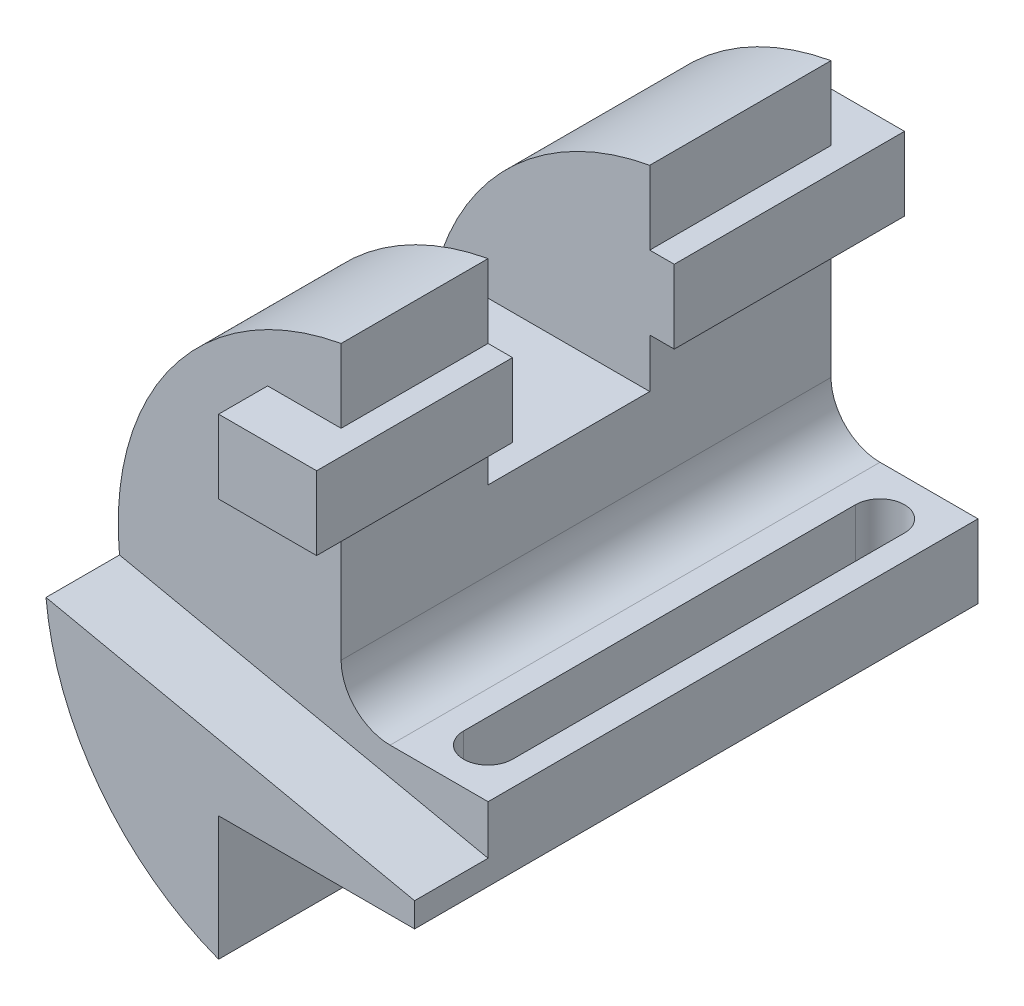
ISO-10303-21;
HEADER;
FILE_DESCRIPTION(('STEP AP214'),'2;1');
FILE_NAME('part.step','',(''),(''),'','','');
FILE_SCHEMA(('AUTOMOTIVE_DESIGN { 1 0 10303 214 1 1 1 1 }'));
ENDSEC;
DATA;
#1=APPLICATION_CONTEXT('core data for automotive mechanical design processes');
#2=APPLICATION_PROTOCOL_DEFINITION('international standard','automotive_design',2000,#1);
#3=PRODUCT_CONTEXT('',#1,'mechanical');
#4=PRODUCT('Part','Part','',(#3));
#5=PRODUCT_RELATED_PRODUCT_CATEGORY('part','',(#4));
#6=PRODUCT_DEFINITION_FORMATION('','',#4);
#7=PRODUCT_DEFINITION_CONTEXT('part definition',#1,'design');
#8=PRODUCT_DEFINITION('design','',#6,#7);
#9=PRODUCT_DEFINITION_SHAPE('','',#8);
#10=(LENGTH_UNIT() NAMED_UNIT(*) SI_UNIT(.MILLI.,.METRE.));
#11=(NAMED_UNIT(*) PLANE_ANGLE_UNIT() SI_UNIT($,.RADIAN.));
#12=(NAMED_UNIT(*) SI_UNIT($,.STERADIAN.) SOLID_ANGLE_UNIT());
#13=UNCERTAINTY_MEASURE_WITH_UNIT(LENGTH_MEASURE(1.E-05),#10,'distance_accuracy_value','');
#14=(GEOMETRIC_REPRESENTATION_CONTEXT(3) GLOBAL_UNCERTAINTY_ASSIGNED_CONTEXT((#13)) GLOBAL_UNIT_ASSIGNED_CONTEXT((#10,
#11,#12)) REPRESENTATION_CONTEXT('',''));
#15=CARTESIAN_POINT('',(0.,0.,0.));
#16=DIRECTION('',(0.,0.,1.));
#17=DIRECTION('',(1.,0.,0.));
#18=AXIS2_PLACEMENT_3D('',#15,#16,#17);
#19=CARTESIAN_POINT('',(0.,0.,100.));
#20=DIRECTION('',(0.,0.,1.));
#21=DIRECTION('',(1.,0.,0.));
#22=AXIS2_PLACEMENT_3D('',#19,#20,#21);
#23=PLANE('',#22);
#24=CARTESIAN_POINT('',(0.,0.,100.));
#25=DIRECTION('',(0.,0.,1.));
#26=DIRECTION('',(1.,0.,0.));
#27=AXIS2_PLACEMENT_3D('',#24,#25,#26);
#28=CIRCLE('',#27,55.5);
#29=CARTESIAN_POINT('',(-10.,54.5916660306315,100.));
#30=VERTEX_POINT('',#29);
#31=CARTESIAN_POINT('',(-55.2350441418964,-5.41663166947498,100.));
#32=VERTEX_POINT('',#31);
#33=EDGE_CURVE('E474',#30,#32,#28,.T.);
#34=ORIENTED_EDGE('',*,*,#33,.T.);
#35=DIRECTION('',(-0.978147600733806,0.207911690817756,0.));
#36=VECTOR('',#35,1.);
#37=CARTESIAN_POINT('',(20.,-21.4083339693685,100.));
#38=LINE('',#37,#36);
#39=CARTESIAN_POINT('',(20.,-21.4083339693685,100.));
#40=VERTEX_POINT('',#39);
#41=EDGE_CURVE('E267',#40,#32,#38,.T.);
#42=ORIENTED_EDGE('',*,*,#41,.F.);
#43=DIRECTION('',(0.,1.,0.));
#44=VECTOR('',#43,1.);
#45=CARTESIAN_POINT('',(20.,-11.4083339693685,100.));
#46=LINE('',#45,#44);
#47=CARTESIAN_POINT('',(20.,-11.4083339693685,100.));
#48=VERTEX_POINT('',#47);
#49=EDGE_CURVE('E477',#40,#48,#46,.T.);
#50=ORIENTED_EDGE('',*,*,#49,.T.);
#51=DIRECTION('',(-1.,0.,0.));
#52=VECTOR('',#51,1.);
#53=CARTESIAN_POINT('',(0.,-11.4083339693685,100.));
#54=LINE('',#53,#52);
#55=CARTESIAN_POINT('',(0.,-11.4083339693685,100.));
#56=VERTEX_POINT('',#55);
#57=EDGE_CURVE('E481',#48,#56,#54,.T.);
#58=ORIENTED_EDGE('',*,*,#57,.T.);
#59=CARTESIAN_POINT('',(0.,-1.40833396936854,100.));
#60=DIRECTION('',(0.,0.,-1.));
#61=DIRECTION('',(1.,0.,0.));
#62=AXIS2_PLACEMENT_3D('',#59,#60,#61);
#63=CIRCLE('',#62,10.);
#64=CARTESIAN_POINT('',(-9.99999999999999,-1.40833396936854,100.));
#65=VERTEX_POINT('',#64);
#66=EDGE_CURVE('E484',#56,#65,#63,.T.);
#67=ORIENTED_EDGE('',*,*,#66,.T.);
#68=DIRECTION('',(0.,1.,0.));
#69=VECTOR('',#68,1.);
#70=CARTESIAN_POINT('',(-10.,54.5916660306315,100.));
#71=LINE('',#70,#69);
#72=CARTESIAN_POINT('',(-10.,24.5916660306315,100.));
#73=VERTEX_POINT('',#72);
#74=EDGE_CURVE('E488',#65,#73,#71,.T.);
#75=ORIENTED_EDGE('',*,*,#74,.T.);
#76=DIRECTION('',(-1.,0.,0.));
#77=VECTOR('',#76,1.);
#78=CARTESIAN_POINT('',(0.,24.5916660306315,100.));
#79=LINE('',#78,#77);
#80=CARTESIAN_POINT('',(-25.,24.5916660306315,100.));
#81=VERTEX_POINT('',#80);
#82=EDGE_CURVE('E428',#73,#81,#79,.T.);
#83=ORIENTED_EDGE('',*,*,#82,.T.);
#84=DIRECTION('',(0.,1.,0.));
#85=VECTOR('',#84,1.);
#86=CARTESIAN_POINT('',(-25.,0.,100.));
#87=LINE('',#86,#85);
#88=CARTESIAN_POINT('',(-25.,39.5916660306315,100.));
#89=VERTEX_POINT('',#88);
#90=EDGE_CURVE('E424',#81,#89,#87,.T.);
#91=ORIENTED_EDGE('',*,*,#90,.T.);
#92=DIRECTION('',(1.,0.,0.));
#93=VECTOR('',#92,1.);
#94=CARTESIAN_POINT('',(0.,39.5916660306315,100.));
#95=LINE('',#94,#93);
#96=CARTESIAN_POINT('',(-10.,39.5916660306315,100.));
#97=VERTEX_POINT('',#96);
#98=EDGE_CURVE('E436',#89,#97,#95,.T.);
#99=ORIENTED_EDGE('',*,*,#98,.T.);
#100=EDGE_CURVE('E487',#97,#30,#71,.T.);
#101=ORIENTED_EDGE('',*,*,#100,.T.);
#102=EDGE_LOOP('',(#34,#42,#50,#58,#67,#75,#83,#91,#99,#101));
#103=FACE_BOUND('',#102,.T.);
#104=ADVANCED_FACE('F45',(#103),#23,.T.);
#105=CARTESIAN_POINT('',(-10.,54.5916660306315,100.));
#106=DIRECTION('',(-1.,0.,0.));
#107=DIRECTION('',(0.,-1.,0.));
#108=AXIS2_PLACEMENT_3D('',#105,#106,#107);
#109=PLANE('',#108);
#110=DIRECTION('',(0.,0.,-1.));
#111=VECTOR('',#110,1.);
#112=CARTESIAN_POINT('',(-10.,24.5916660306315,100.));
#113=LINE('',#112,#111);
#114=CARTESIAN_POINT('',(-9.99999999999999,24.5916660306315,37.));
#115=VERTEX_POINT('',#114);
#116=CARTESIAN_POINT('',(-10.,24.5916660306315,0.));
#117=VERTEX_POINT('',#116);
#118=EDGE_CURVE('E385',#115,#117,#113,.T.);
#119=ORIENTED_EDGE('',*,*,#118,.F.);
#120=DIRECTION('',(0.,1.,0.));
#121=VECTOR('',#120,1.);
#122=CARTESIAN_POINT('',(-9.99999999999999,14.5916660306315,37.));
#123=LINE('',#122,#121);
#124=CARTESIAN_POINT('',(-9.99999999999999,14.5916660306315,37.));
#125=VERTEX_POINT('',#124);
#126=EDGE_CURVE('E462',#125,#115,#123,.T.);
#127=ORIENTED_EDGE('',*,*,#126,.F.);
#128=DIRECTION('',(0.,0.,-1.));
#129=VECTOR('',#128,1.);
#130=CARTESIAN_POINT('',(-9.99999999999999,14.5916660306315,70.));
#131=LINE('',#130,#129);
#132=CARTESIAN_POINT('',(-9.99999999999999,14.5916660306315,70.));
#133=VERTEX_POINT('',#132);
#134=EDGE_CURVE('E457',#133,#125,#131,.T.);
#135=ORIENTED_EDGE('',*,*,#134,.F.);
#136=DIRECTION('',(0.,-1.,0.));
#137=VECTOR('',#136,1.);
#138=CARTESIAN_POINT('',(-10.,54.5916660306315,70.));
#139=LINE('',#138,#137);
#140=CARTESIAN_POINT('',(-9.99999999999999,24.5916660306315,70.));
#141=VERTEX_POINT('',#140);
#142=EDGE_CURVE('E452',#141,#133,#139,.T.);
#143=ORIENTED_EDGE('',*,*,#142,.F.);
#144=DIRECTION('',(0.,0.,-1.));
#145=VECTOR('',#144,1.);
#146=CARTESIAN_POINT('',(-10.,24.5916660306315,100.));
#147=LINE('',#146,#145);
#148=EDGE_CURVE('E432',#73,#141,#147,.T.);
#149=ORIENTED_EDGE('',*,*,#148,.F.);
#150=ORIENTED_EDGE('',*,*,#74,.F.);
#151=DIRECTION('',(0.,0.,-1.));
#152=VECTOR('',#151,1.);
#153=CARTESIAN_POINT('',(-9.99999999999999,-1.40833396936854,100.));
#154=LINE('',#153,#152);
#155=CARTESIAN_POINT('',(-9.99999999999999,-1.40833396936854,0.));
#156=VERTEX_POINT('',#155);
#157=EDGE_CURVE('E518',#65,#156,#154,.T.);
#158=ORIENTED_EDGE('',*,*,#157,.T.);
#159=DIRECTION('',(0.,1.,0.));
#160=VECTOR('',#159,1.);
#161=CARTESIAN_POINT('',(-10.,54.5916660306315,0.));
#162=LINE('',#161,#160);
#163=EDGE_CURVE('E478',#156,#117,#162,.T.);
#164=ORIENTED_EDGE('',*,*,#163,.T.);
#165=EDGE_LOOP('',(#119,#127,#135,#143,#149,#150,#158,#164));
#166=FACE_BOUND('',#165,.T.);
#167=ADVANCED_FACE('F562',(#166),#109,.F.);
#168=DIRECTION('',(0.,0.,1.));
#169=VECTOR('',#168,1.);
#170=CARTESIAN_POINT('',(-10.,39.5916660306315,100.));
#171=LINE('',#170,#169);
#172=CARTESIAN_POINT('',(-10.,39.5916660306315,0.));
#173=VERTEX_POINT('',#172);
#174=CARTESIAN_POINT('',(-9.99999999999999,39.5916660306315,37.));
#175=VERTEX_POINT('',#174);
#176=EDGE_CURVE('E379',#173,#175,#171,.T.);
#177=ORIENTED_EDGE('',*,*,#176,.F.);
#178=CARTESIAN_POINT('',(-10.,54.5916660306315,0.));
#179=VERTEX_POINT('',#178);
#180=EDGE_CURVE('E510',#173,#179,#162,.T.);
#181=ORIENTED_EDGE('',*,*,#180,.T.);
#182=DIRECTION('',(0.,0.,-1.));
#183=VECTOR('',#182,1.);
#184=CARTESIAN_POINT('',(-10.,54.5916660306315,100.));
#185=LINE('',#184,#183);
#186=CARTESIAN_POINT('',(-10.,54.5916660306315,37.));
#187=VERTEX_POINT('',#186);
#188=EDGE_CURVE('E492',#187,#179,#185,.T.);
#189=ORIENTED_EDGE('',*,*,#188,.F.);
#190=EDGE_CURVE('E461',#175,#187,#123,.T.);
#191=ORIENTED_EDGE('',*,*,#190,.F.);
#192=EDGE_LOOP('',(#177,#181,#189,#191));
#193=FACE_BOUND('',#192,.T.);
#194=ADVANCED_FACE('F568',(#193),#109,.F.);
#195=CARTESIAN_POINT('',(0.,0.,0.));
#196=DIRECTION('',(0.,0.,1.));
#197=DIRECTION('',(1.,0.,0.));
#198=AXIS2_PLACEMENT_3D('',#195,#196,#197);
#199=PLANE('',#198);
#200=DIRECTION('',(1.,0.,0.));
#201=VECTOR('',#200,1.);
#202=CARTESIAN_POINT('',(0.,39.5916660306315,0.));
#203=LINE('',#202,#201);
#204=CARTESIAN_POINT('',(-25.,39.5916660306315,0.));
#205=VERTEX_POINT('',#204);
#206=EDGE_CURVE('E376',#205,#173,#203,.T.);
#207=ORIENTED_EDGE('',*,*,#206,.F.);
#208=DIRECTION('',(0.,1.,0.));
#209=VECTOR('',#208,1.);
#210=CARTESIAN_POINT('',(-25.,0.,0.));
#211=LINE('',#210,#209);
#212=CARTESIAN_POINT('',(-25.,24.5916660306315,0.));
#213=VERTEX_POINT('',#212);
#214=EDGE_CURVE('E346',#213,#205,#211,.T.);
#215=ORIENTED_EDGE('',*,*,#214,.F.);
#216=DIRECTION('',(-1.,0.,0.));
#217=VECTOR('',#216,1.);
#218=CARTESIAN_POINT('',(0.,24.5916660306315,0.));
#219=LINE('',#218,#217);
#220=EDGE_CURVE('E382',#117,#213,#219,.T.);
#221=ORIENTED_EDGE('',*,*,#220,.F.);
#222=ORIENTED_EDGE('',*,*,#163,.F.);
#223=CARTESIAN_POINT('',(0.,-1.40833396936854,0.));
#224=DIRECTION('',(0.,0.,-1.));
#225=DIRECTION('',(1.,0.,0.));
#226=AXIS2_PLACEMENT_3D('',#223,#224,#225);
#227=CIRCLE('',#226,10.);
#228=CARTESIAN_POINT('',(0.,-11.4083339693685,0.));
#229=VERTEX_POINT('',#228);
#230=EDGE_CURVE('E507',#229,#156,#227,.T.);
#231=ORIENTED_EDGE('',*,*,#230,.F.);
#232=DIRECTION('',(-1.,0.,0.));
#233=VECTOR('',#232,1.);
#234=CARTESIAN_POINT('',(0.,-11.4083339693685,0.));
#235=LINE('',#234,#233);
#236=CARTESIAN_POINT('',(20.,-11.4083339693685,0.));
#237=VERTEX_POINT('',#236);
#238=EDGE_CURVE('E504',#237,#229,#235,.T.);
#239=ORIENTED_EDGE('',*,*,#238,.F.);
#240=DIRECTION('',(0.,1.,0.));
#241=VECTOR('',#240,1.);
#242=CARTESIAN_POINT('',(20.,-11.4083339693685,0.));
#243=LINE('',#242,#241);
#244=CARTESIAN_POINT('',(20.,-26.4083339693685,0.));
#245=VERTEX_POINT('',#244);
#246=EDGE_CURVE('E501',#245,#237,#243,.T.);
#247=ORIENTED_EDGE('',*,*,#246,.F.);
#248=DIRECTION('',(1.,0.,0.));
#249=VECTOR('',#248,1.);
#250=CARTESIAN_POINT('',(20.,-26.4083339693685,0.));
#251=LINE('',#250,#249);
#252=CARTESIAN_POINT('',(-20.,-26.4083339693685,0.));
#253=VERTEX_POINT('',#252);
#254=EDGE_CURVE('E242',#253,#245,#251,.T.);
#255=ORIENTED_EDGE('',*,*,#254,.F.);
#256=DIRECTION('',(0.,1.,0.));
#257=VECTOR('',#256,1.);
#258=CARTESIAN_POINT('',(-20.,-26.4083339693685,0.));
#259=LINE('',#258,#257);
#260=CARTESIAN_POINT('',(-20.,-51.7711309515255,0.));
#261=VERTEX_POINT('',#260);
#262=EDGE_CURVE('E496',#261,#253,#259,.T.);
#263=ORIENTED_EDGE('',*,*,#262,.F.);
#264=CARTESIAN_POINT('',(0.,0.,0.));
#265=DIRECTION('',(0.,0.,1.));
#266=DIRECTION('',(1.,0.,0.));
#267=AXIS2_PLACEMENT_3D('',#264,#265,#266);
#268=CIRCLE('',#267,55.5);
#269=EDGE_CURVE('E470',#179,#261,#268,.T.);
#270=ORIENTED_EDGE('',*,*,#269,.F.);
#271=ORIENTED_EDGE('',*,*,#180,.F.);
#272=EDGE_LOOP('',(#207,#215,#221,#222,#231,#239,#247,#255,#263,#270,#271));
#273=FACE_BOUND('',#272,.T.);
#274=ADVANCED_FACE('F531',(#273),#199,.F.);
#275=DIRECTION('',(0.,0.,1.));
#276=VECTOR('',#275,1.);
#277=CARTESIAN_POINT('',(-10.,39.5916660306315,100.));
#278=LINE('',#277,#276);
#279=CARTESIAN_POINT('',(-9.99999999999999,39.5916660306315,70.));
#280=VERTEX_POINT('',#279);
#281=EDGE_CURVE('E440',#280,#97,#278,.T.);
#282=ORIENTED_EDGE('',*,*,#281,.F.);
#283=CARTESIAN_POINT('',(-10.,54.5916660306315,70.));
#284=VERTEX_POINT('',#283);
#285=EDGE_CURVE('E453',#284,#280,#139,.T.);
#286=ORIENTED_EDGE('',*,*,#285,.F.);
#287=EDGE_CURVE('E514',#30,#284,#185,.T.);
#288=ORIENTED_EDGE('',*,*,#287,.F.);
#289=ORIENTED_EDGE('',*,*,#100,.F.);
#290=EDGE_LOOP('',(#282,#286,#288,#289));
#291=FACE_BOUND('',#290,.T.);
#292=ADVANCED_FACE('F560',(#291),#109,.F.);
#293=CARTESIAN_POINT('',(0.,0.,100.));
#294=DIRECTION('',(0.,0.,-1.));
#295=DIRECTION('',(-1.,0.,0.));
#296=AXIS2_PLACEMENT_3D('',#293,#294,#295);
#297=CYLINDRICAL_SURFACE('',#296,55.5);
#298=DIRECTION('',(0.,0.,-1.));
#299=VECTOR('',#298,1.);
#300=CARTESIAN_POINT('',(-53.5474862383895,14.5916660306314,100.));
#301=LINE('',#300,#299);
#302=CARTESIAN_POINT('',(-53.5474862383895,14.5916660306314,37.));
#303=VERTEX_POINT('',#302);
#304=CARTESIAN_POINT('',(-53.5474862383895,14.5916660306314,70.));
#305=VERTEX_POINT('',#304);
#306=EDGE_CURVE('E446',#303,#305,#301,.F.);
#307=ORIENTED_EDGE('',*,*,#306,.F.);
#308=CARTESIAN_POINT('',(0.,0.,37.));
#309=DIRECTION('',(0.,0.,-1.));
#310=DIRECTION('',(-1.,0.,0.));
#311=AXIS2_PLACEMENT_3D('',#308,#309,#310);
#312=CIRCLE('',#311,55.5);
#313=EDGE_CURVE('E449',#187,#303,#312,.F.);
#314=ORIENTED_EDGE('',*,*,#313,.F.);
#315=ORIENTED_EDGE('',*,*,#188,.T.);
#316=ORIENTED_EDGE('',*,*,#269,.T.);
#317=DIRECTION('',(0.,0.,-1.));
#318=VECTOR('',#317,1.);
#319=CARTESIAN_POINT('',(-20.,-51.7711309515255,100.));
#320=LINE('',#319,#318);
#321=CARTESIAN_POINT('',(-20.,-51.7711309515255,100.));
#322=VERTEX_POINT('',#321);
#323=EDGE_CURVE('E11',#322,#261,#320,.T.);
#324=ORIENTED_EDGE('',*,*,#323,.F.);
#325=CARTESIAN_POINT('',(0.,0.,100.));
#326=DIRECTION('',(0.,0.,1.));
#327=DIRECTION('',(1.,0.,0.));
#328=AXIS2_PLACEMENT_3D('',#325,#326,#327);
#329=CIRCLE('',#328,55.5);
#330=EDGE_CURVE('E61',#32,#322,#329,.T.);
#331=ORIENTED_EDGE('',*,*,#330,.F.);
#332=ORIENTED_EDGE('',*,*,#33,.F.);
#333=ORIENTED_EDGE('',*,*,#287,.T.);
#334=CARTESIAN_POINT('',(0.,0.,70.));
#335=DIRECTION('',(0.,0.,1.));
#336=DIRECTION('',(1.,0.,0.));
#337=AXIS2_PLACEMENT_3D('',#334,#335,#336);
#338=CIRCLE('',#337,55.5);
#339=EDGE_CURVE('E443',#305,#284,#338,.F.);
#340=ORIENTED_EDGE('',*,*,#339,.F.);
#341=EDGE_LOOP('',(#307,#314,#315,#316,#324,#331,#332,#333,#340));
#342=FACE_BOUND('',#341,.T.);
#343=ADVANCED_FACE('F47',(#342),#297,.T.);
#344=CARTESIAN_POINT('',(-20.,-26.4083339693685,100.));
#345=DIRECTION('',(-1.,0.,0.));
#346=DIRECTION('',(0.,-1.,0.));
#347=AXIS2_PLACEMENT_3D('',#344,#345,#346);
#348=PLANE('',#347);
#349=ORIENTED_EDGE('',*,*,#262,.T.);
#350=DIRECTION('',(0.,0.,-1.));
#351=VECTOR('',#350,1.);
#352=CARTESIAN_POINT('',(-20.,-26.4083339693685,100.));
#353=LINE('',#352,#351);
#354=CARTESIAN_POINT('',(-20.,-26.4083339693685,115.));
#355=VERTEX_POINT('',#354);
#356=EDGE_CURVE('E54',#355,#253,#353,.T.);
#357=ORIENTED_EDGE('',*,*,#356,.F.);
#358=DIRECTION('',(0.,1.,0.));
#359=VECTOR('',#358,1.);
#360=CARTESIAN_POINT('',(-20.,-26.4083339693685,115.));
#361=LINE('',#360,#359);
#362=CARTESIAN_POINT('',(-20.,-51.7711309515255,115.));
#363=VERTEX_POINT('',#362);
#364=EDGE_CURVE('E261',#363,#355,#361,.T.);
#365=ORIENTED_EDGE('',*,*,#364,.F.);
#366=DIRECTION('',(0.,0.,-1.));
#367=VECTOR('',#366,1.);
#368=CARTESIAN_POINT('',(-20.,-51.7711309515255,115.));
#369=LINE('',#368,#367);
#370=EDGE_CURVE('E277',#363,#322,#369,.T.);
#371=ORIENTED_EDGE('',*,*,#370,.T.);
#372=ORIENTED_EDGE('',*,*,#323,.T.);
#373=EDGE_LOOP('',(#349,#357,#365,#371,#372));
#374=FACE_BOUND('',#373,.T.);
#375=ADVANCED_FACE('F552',(#374),#348,.F.);
#376=CARTESIAN_POINT('',(20.,-26.4083339693685,100.));
#377=DIRECTION('',(0.,1.,0.));
#378=DIRECTION('',(-1.,0.,0.));
#379=AXIS2_PLACEMENT_3D('',#376,#377,#378);
#380=PLANE('',#379);
#381=DIRECTION('',(0.,0.,-1.));
#382=VECTOR('',#381,1.);
#383=CARTESIAN_POINT('',(15.,-26.4083339693685,100.));
#384=LINE('',#383,#382);
#385=CARTESIAN_POINT('',(15.,-26.4083339693685,90.));
#386=VERTEX_POINT('',#385);
#387=CARTESIAN_POINT('',(15.,-26.4083339693685,10.));
#388=VERTEX_POINT('',#387);
#389=EDGE_CURVE('E326',#386,#388,#384,.T.);
#390=ORIENTED_EDGE('',*,*,#389,.T.);
#391=CARTESIAN_POINT('',(10.,-26.4083339693685,10.));
#392=DIRECTION('',(0.,1.,0.));
#393=DIRECTION('',(-1.,0.,0.));
#394=AXIS2_PLACEMENT_3D('',#391,#392,#393);
#395=CIRCLE('',#394,5.);
#396=CARTESIAN_POINT('',(5.,-26.4083339693685,10.));
#397=VERTEX_POINT('',#396);
#398=EDGE_CURVE('E330',#388,#397,#395,.T.);
#399=ORIENTED_EDGE('',*,*,#398,.T.);
#400=DIRECTION('',(0.,0.,1.));
#401=VECTOR('',#400,1.);
#402=CARTESIAN_POINT('',(5.00000000000001,-26.4083339693685,100.));
#403=LINE('',#402,#401);
#404=CARTESIAN_POINT('',(5.00000000000001,-26.4083339693685,90.));
#405=VERTEX_POINT('',#404);
#406=EDGE_CURVE('E310',#397,#405,#403,.T.);
#407=ORIENTED_EDGE('',*,*,#406,.T.);
#408=CARTESIAN_POINT('',(10.,-26.4083339693685,90.));
#409=DIRECTION('',(0.,1.,0.));
#410=DIRECTION('',(-1.,0.,0.));
#411=AXIS2_PLACEMENT_3D('',#408,#409,#410);
#412=CIRCLE('',#411,5.);
#413=EDGE_CURVE('E322',#405,#386,#412,.T.);
#414=ORIENTED_EDGE('',*,*,#413,.T.);
#415=EDGE_LOOP('',(#390,#399,#407,#414));
#416=FACE_BOUND('',#415,.T.);
#417=ORIENTED_EDGE('',*,*,#254,.T.);
#418=DIRECTION('',(0.,0.,-1.));
#419=VECTOR('',#418,1.);
#420=CARTESIAN_POINT('',(20.,-26.4083339693685,100.));
#421=LINE('',#420,#419);
#422=CARTESIAN_POINT('',(20.,-26.4083339693685,115.));
#423=VERTEX_POINT('',#422);
#424=EDGE_CURVE('E235',#423,#245,#421,.T.);
#425=ORIENTED_EDGE('',*,*,#424,.F.);
#426=DIRECTION('',(1.,0.,0.));
#427=VECTOR('',#426,1.);
#428=CARTESIAN_POINT('',(20.,-26.4083339693685,115.));
#429=LINE('',#428,#427);
#430=EDGE_CURVE('E240',#355,#423,#429,.T.);
#431=ORIENTED_EDGE('',*,*,#430,.F.);
#432=ORIENTED_EDGE('',*,*,#356,.T.);
#433=EDGE_LOOP('',(#417,#425,#431,#432));
#434=FACE_BOUND('',#433,.T.);
#435=ADVANCED_FACE('F237',(#416,#434),#380,.F.);
#436=CARTESIAN_POINT('',(20.,-11.4083339693685,100.));
#437=DIRECTION('',(-1.,0.,0.));
#438=DIRECTION('',(0.,-1.,0.));
#439=AXIS2_PLACEMENT_3D('',#436,#437,#438);
#440=PLANE('',#439);
#441=ORIENTED_EDGE('',*,*,#246,.T.);
#442=DIRECTION('',(0.,0.,-1.));
#443=VECTOR('',#442,1.);
#444=CARTESIAN_POINT('',(20.,-11.4083339693685,100.));
#445=LINE('',#444,#443);
#446=EDGE_CURVE('E246',#48,#237,#445,.T.);
#447=ORIENTED_EDGE('',*,*,#446,.F.);
#448=ORIENTED_EDGE('',*,*,#49,.F.);
#449=DIRECTION('',(0.,0.,-1.));
#450=VECTOR('',#449,1.);
#451=CARTESIAN_POINT('',(20.,-21.4083339693685,115.));
#452=LINE('',#451,#450);
#453=CARTESIAN_POINT('',(20.,-21.4083339693685,115.));
#454=VERTEX_POINT('',#453);
#455=EDGE_CURVE('E252',#454,#40,#452,.T.);
#456=ORIENTED_EDGE('',*,*,#455,.F.);
#457=DIRECTION('',(0.,1.,0.));
#458=VECTOR('',#457,1.);
#459=CARTESIAN_POINT('',(20.,-26.4083339693685,115.));
#460=LINE('',#459,#458);
#461=EDGE_CURVE('E249',#423,#454,#460,.T.);
#462=ORIENTED_EDGE('',*,*,#461,.F.);
#463=ORIENTED_EDGE('',*,*,#424,.T.);
#464=EDGE_LOOP('',(#441,#447,#448,#456,#462,#463));
#465=FACE_BOUND('',#464,.T.);
#466=ADVANCED_FACE('F250',(#465),#440,.F.);
#467=CARTESIAN_POINT('',(0.,-11.4083339693685,100.));
#468=DIRECTION('',(0.,-1.,0.));
#469=DIRECTION('',(0.,0.,-1.));
#470=AXIS2_PLACEMENT_3D('',#467,#468,#469);
#471=PLANE('',#470);
#472=DIRECTION('',(0.,0.,1.));
#473=VECTOR('',#472,1.);
#474=CARTESIAN_POINT('',(5.,-11.4083339693685,10.));
#475=LINE('',#474,#473);
#476=CARTESIAN_POINT('',(5.,-11.4083339693685,10.));
#477=VERTEX_POINT('',#476);
#478=CARTESIAN_POINT('',(5.00000000000001,-11.4083339693685,90.));
#479=VERTEX_POINT('',#478);
#480=EDGE_CURVE('E295',#477,#479,#475,.T.);
#481=ORIENTED_EDGE('',*,*,#480,.F.);
#482=CARTESIAN_POINT('',(10.,-11.4083339693685,10.));
#483=DIRECTION('',(0.,1.,0.));
#484=DIRECTION('',(0.,0.,1.));
#485=AXIS2_PLACEMENT_3D('',#482,#483,#484);
#486=CIRCLE('',#485,5.);
#487=CARTESIAN_POINT('',(15.,-11.4083339693685,10.));
#488=VERTEX_POINT('',#487);
#489=EDGE_CURVE('E292',#488,#477,#486,.T.);
#490=ORIENTED_EDGE('',*,*,#489,.F.);
#491=DIRECTION('',(0.,0.,-1.));
#492=VECTOR('',#491,1.);
#493=CARTESIAN_POINT('',(15.,-11.4083339693685,10.));
#494=LINE('',#493,#492);
#495=CARTESIAN_POINT('',(15.,-11.4083339693685,90.));
#496=VERTEX_POINT('',#495);
#497=EDGE_CURVE('E302',#496,#488,#494,.T.);
#498=ORIENTED_EDGE('',*,*,#497,.F.);
#499=CARTESIAN_POINT('',(10.,-11.4083339693685,90.));
#500=DIRECTION('',(0.,1.,0.));
#501=DIRECTION('',(0.,0.,1.));
#502=AXIS2_PLACEMENT_3D('',#499,#500,#501);
#503=CIRCLE('',#502,5.);
#504=EDGE_CURVE('E298',#479,#496,#503,.T.);
#505=ORIENTED_EDGE('',*,*,#504,.F.);
#506=EDGE_LOOP('',(#481,#490,#498,#505));
#507=FACE_BOUND('',#506,.T.);
#508=ORIENTED_EDGE('',*,*,#238,.T.);
#509=DIRECTION('',(0.,0.,-1.));
#510=VECTOR('',#509,1.);
#511=CARTESIAN_POINT('',(0.,-11.4083339693685,100.));
#512=LINE('',#511,#510);
#513=EDGE_CURVE('E522',#56,#229,#512,.T.);
#514=ORIENTED_EDGE('',*,*,#513,.F.);
#515=ORIENTED_EDGE('',*,*,#57,.F.);
#516=ORIENTED_EDGE('',*,*,#446,.T.);
#517=EDGE_LOOP('',(#508,#514,#515,#516));
#518=FACE_BOUND('',#517,.T.);
#519=ADVANCED_FACE('F538',(#507,#518),#471,.F.);
#520=CARTESIAN_POINT('',(0.,-1.40833396936854,100.));
#521=DIRECTION('',(0.,0.,-1.));
#522=DIRECTION('',(-1.,0.,0.));
#523=AXIS2_PLACEMENT_3D('',#520,#521,#522);
#524=CYLINDRICAL_SURFACE('',#523,10.);
#525=ORIENTED_EDGE('',*,*,#230,.T.);
#526=ORIENTED_EDGE('',*,*,#157,.F.);
#527=ORIENTED_EDGE('',*,*,#66,.F.);
#528=ORIENTED_EDGE('',*,*,#513,.T.);
#529=EDGE_LOOP('',(#525,#526,#527,#528));
#530=FACE_BOUND('',#529,.T.);
#531=ADVANCED_FACE('F579',(#530),#524,.F.);
#532=CARTESIAN_POINT('',(-55.501,14.5916660306314,37.));
#533=DIRECTION('',(0.,0.,-1.));
#534=DIRECTION('',(-1.,0.,0.));
#535=AXIS2_PLACEMENT_3D('',#532,#533,#534);
#536=PLANE('',#535);
#537=DIRECTION('',(-1.,0.,0.));
#538=VECTOR('',#537,1.);
#539=CARTESIAN_POINT('',(-5.,39.5916660306315,37.));
#540=LINE('',#539,#538);
#541=CARTESIAN_POINT('',(-5.,39.5916660306315,37.));
#542=VERTEX_POINT('',#541);
#543=EDGE_CURVE('E363',#542,#175,#540,.T.);
#544=ORIENTED_EDGE('',*,*,#543,.T.);
#545=ORIENTED_EDGE('',*,*,#190,.T.);
#546=ORIENTED_EDGE('',*,*,#313,.T.);
#547=DIRECTION('',(1.,0.,0.));
#548=VECTOR('',#547,1.);
#549=CARTESIAN_POINT('',(-55.501,14.5916660306314,37.));
#550=LINE('',#549,#548);
#551=EDGE_CURVE('E467',#303,#125,#550,.T.);
#552=ORIENTED_EDGE('',*,*,#551,.T.);
#553=ORIENTED_EDGE('',*,*,#126,.T.);
#554=DIRECTION('',(-1.,0.,0.));
#555=VECTOR('',#554,1.);
#556=CARTESIAN_POINT('',(-5.,24.5916660306315,37.));
#557=LINE('',#556,#555);
#558=CARTESIAN_POINT('',(-5.,24.5916660306315,37.));
#559=VERTEX_POINT('',#558);
#560=EDGE_CURVE('E373',#559,#115,#557,.T.);
#561=ORIENTED_EDGE('',*,*,#560,.F.);
#562=DIRECTION('',(0.,-1.,0.));
#563=VECTOR('',#562,1.);
#564=CARTESIAN_POINT('',(-5.,24.5916660306315,37.));
#565=LINE('',#564,#563);
#566=EDGE_CURVE('E350',#542,#559,#565,.T.);
#567=ORIENTED_EDGE('',*,*,#566,.F.);
#568=EDGE_LOOP('',(#544,#545,#546,#552,#553,#561,#567));
#569=FACE_BOUND('',#568,.T.);
#570=ADVANCED_FACE('F582',(#569),#536,.F.);
#571=CARTESIAN_POINT('',(-55.501,14.5916660306314,70.));
#572=DIRECTION('',(0.,-1.,0.));
#573=DIRECTION('',(1.,0.,0.));
#574=AXIS2_PLACEMENT_3D('',#571,#572,#573);
#575=PLANE('',#574);
#576=ORIENTED_EDGE('',*,*,#306,.T.);
#577=DIRECTION('',(1.,0.,0.));
#578=VECTOR('',#577,1.);
#579=CARTESIAN_POINT('',(-55.501,14.5916660306314,70.));
#580=LINE('',#579,#578);
#581=EDGE_CURVE('E466',#305,#133,#580,.T.);
#582=ORIENTED_EDGE('',*,*,#581,.T.);
#583=ORIENTED_EDGE('',*,*,#134,.T.);
#584=ORIENTED_EDGE('',*,*,#551,.F.);
#585=EDGE_LOOP('',(#576,#582,#583,#584));
#586=FACE_BOUND('',#585,.T.);
#587=ADVANCED_FACE('F793',(#586),#575,.F.);
#588=CARTESIAN_POINT('',(-55.501,54.5916660306315,70.));
#589=DIRECTION('',(0.,0.,1.));
#590=DIRECTION('',(1.,0.,0.));
#591=AXIS2_PLACEMENT_3D('',#588,#589,#590);
#592=PLANE('',#591);
#593=DIRECTION('',(-1.,0.,0.));
#594=VECTOR('',#593,1.);
#595=CARTESIAN_POINT('',(5.,39.5916660306315,70.));
#596=LINE('',#595,#594);
#597=CARTESIAN_POINT('',(-4.99999999999999,39.5916660306315,70.));
#598=VERTEX_POINT('',#597);
#599=EDGE_CURVE('E421',#598,#280,#596,.T.);
#600=ORIENTED_EDGE('',*,*,#599,.F.);
#601=DIRECTION('',(0.,1.,0.));
#602=VECTOR('',#601,1.);
#603=CARTESIAN_POINT('',(-4.99999999999999,39.5916660306315,70.));
#604=LINE('',#603,#602);
#605=CARTESIAN_POINT('',(-4.99999999999999,24.5916660306315,70.));
#606=VERTEX_POINT('',#605);
#607=EDGE_CURVE('E391',#606,#598,#604,.T.);
#608=ORIENTED_EDGE('',*,*,#607,.F.);
#609=DIRECTION('',(-1.,0.,0.));
#610=VECTOR('',#609,1.);
#611=CARTESIAN_POINT('',(5.,24.5916660306315,70.));
#612=LINE('',#611,#610);
#613=EDGE_CURVE('E412',#606,#141,#612,.T.);
#614=ORIENTED_EDGE('',*,*,#613,.T.);
#615=ORIENTED_EDGE('',*,*,#142,.T.);
#616=ORIENTED_EDGE('',*,*,#581,.F.);
#617=ORIENTED_EDGE('',*,*,#339,.T.);
#618=ORIENTED_EDGE('',*,*,#285,.T.);
#619=EDGE_LOOP('',(#600,#608,#614,#615,#616,#617,#618));
#620=FACE_BOUND('',#619,.T.);
#621=ADVANCED_FACE('F573',(#620),#592,.F.);
#622=CARTESIAN_POINT('',(5.,39.5916660306315,70.));
#623=DIRECTION('',(0.,-1.,0.));
#624=DIRECTION('',(0.,0.,-1.));
#625=AXIS2_PLACEMENT_3D('',#622,#623,#624);
#626=PLANE('',#625);
#627=DIRECTION('',(-1.,0.,0.));
#628=VECTOR('',#627,1.);
#629=CARTESIAN_POINT('',(5.,39.5916660306315,110.));
#630=LINE('',#629,#628);
#631=CARTESIAN_POINT('',(-4.99999999999999,39.5916660306315,110.));
#632=VERTEX_POINT('',#631);
#633=CARTESIAN_POINT('',(-25.,39.5916660306315,110.));
#634=VERTEX_POINT('',#633);
#635=EDGE_CURVE('E418',#632,#634,#630,.T.);
#636=ORIENTED_EDGE('',*,*,#635,.F.);
#637=DIRECTION('',(0.,0.,1.));
#638=VECTOR('',#637,1.);
#639=CARTESIAN_POINT('',(-4.99999999999999,39.5916660306315,110.));
#640=LINE('',#639,#638);
#641=EDGE_CURVE('E394',#598,#632,#640,.T.);
#642=ORIENTED_EDGE('',*,*,#641,.F.);
#643=ORIENTED_EDGE('',*,*,#599,.T.);
#644=ORIENTED_EDGE('',*,*,#281,.T.);
#645=ORIENTED_EDGE('',*,*,#98,.F.);
#646=DIRECTION('',(0.,0.,1.));
#647=VECTOR('',#646,1.);
#648=CARTESIAN_POINT('',(-25.,39.5916660306315,70.));
#649=LINE('',#648,#647);
#650=EDGE_CURVE('E400',#89,#634,#649,.T.);
#651=ORIENTED_EDGE('',*,*,#650,.T.);
#652=EDGE_LOOP('',(#636,#642,#643,#644,#645,#651));
#653=FACE_BOUND('',#652,.T.);
#654=ADVANCED_FACE('F768',(#653),#626,.F.);
#655=CARTESIAN_POINT('',(5.,24.5916660306315,110.));
#656=DIRECTION('',(0.,1.,0.));
#657=DIRECTION('',(-1.,0.,0.));
#658=AXIS2_PLACEMENT_3D('',#655,#656,#657);
#659=PLANE('',#658);
#660=ORIENTED_EDGE('',*,*,#613,.F.);
#661=DIRECTION('',(0.,0.,-1.));
#662=VECTOR('',#661,1.);
#663=CARTESIAN_POINT('',(-4.99999999999999,24.5916660306315,70.));
#664=LINE('',#663,#662);
#665=CARTESIAN_POINT('',(-4.99999999999999,24.5916660306315,110.));
#666=VERTEX_POINT('',#665);
#667=EDGE_CURVE('E388',#666,#606,#664,.T.);
#668=ORIENTED_EDGE('',*,*,#667,.F.);
#669=DIRECTION('',(-1.,0.,0.));
#670=VECTOR('',#669,1.);
#671=CARTESIAN_POINT('',(5.,24.5916660306315,110.));
#672=LINE('',#671,#670);
#673=CARTESIAN_POINT('',(-25.,24.5916660306315,110.));
#674=VERTEX_POINT('',#673);
#675=EDGE_CURVE('E415',#666,#674,#672,.T.);
#676=ORIENTED_EDGE('',*,*,#675,.T.);
#677=DIRECTION('',(0.,0.,-1.));
#678=VECTOR('',#677,1.);
#679=CARTESIAN_POINT('',(-25.,24.5916660306315,110.));
#680=LINE('',#679,#678);
#681=EDGE_CURVE('E408',#674,#81,#680,.T.);
#682=ORIENTED_EDGE('',*,*,#681,.T.);
#683=ORIENTED_EDGE('',*,*,#82,.F.);
#684=ORIENTED_EDGE('',*,*,#148,.T.);
#685=EDGE_LOOP('',(#660,#668,#676,#682,#683,#684));
#686=FACE_BOUND('',#685,.T.);
#687=ADVANCED_FACE('F759',(#686),#659,.F.);
#688=CARTESIAN_POINT('',(5.,39.5916660306315,110.));
#689=DIRECTION('',(0.,0.,-1.));
#690=DIRECTION('',(-1.,0.,0.));
#691=AXIS2_PLACEMENT_3D('',#688,#689,#690);
#692=PLANE('',#691);
#693=ORIENTED_EDGE('',*,*,#675,.F.);
#694=DIRECTION('',(0.,-1.,0.));
#695=VECTOR('',#694,1.);
#696=CARTESIAN_POINT('',(-4.99999999999999,24.5916660306315,110.));
#697=LINE('',#696,#695);
#698=EDGE_CURVE('E397',#632,#666,#697,.T.);
#699=ORIENTED_EDGE('',*,*,#698,.F.);
#700=ORIENTED_EDGE('',*,*,#635,.T.);
#701=DIRECTION('',(0.,-1.,0.));
#702=VECTOR('',#701,1.);
#703=CARTESIAN_POINT('',(-25.,39.5916660306315,110.));
#704=LINE('',#703,#702);
#705=EDGE_CURVE('E404',#634,#674,#704,.T.);
#706=ORIENTED_EDGE('',*,*,#705,.T.);
#707=EDGE_LOOP('',(#693,#699,#700,#706));
#708=FACE_BOUND('',#707,.T.);
#709=ADVANCED_FACE('F750',(#708),#692,.F.);
#710=CARTESIAN_POINT('',(-25.,0.,0.));
#711=DIRECTION('',(1.,0.,0.));
#712=DIRECTION('',(0.,1.,0.));
#713=AXIS2_PLACEMENT_3D('',#710,#711,#712);
#714=PLANE('',#713);
#715=ORIENTED_EDGE('',*,*,#90,.F.);
#716=ORIENTED_EDGE('',*,*,#681,.F.);
#717=ORIENTED_EDGE('',*,*,#705,.F.);
#718=ORIENTED_EDGE('',*,*,#650,.F.);
#719=EDGE_LOOP('',(#715,#716,#717,#718));
#720=FACE_BOUND('',#719,.T.);
#721=ADVANCED_FACE('F741',(#720),#714,.F.);
#722=CARTESIAN_POINT('',(-4.99999999999999,0.,0.));
#723=DIRECTION('',(-1.,0.,0.));
#724=DIRECTION('',(0.,-1.,0.));
#725=AXIS2_PLACEMENT_3D('',#722,#723,#724);
#726=PLANE('',#725);
#727=ORIENTED_EDGE('',*,*,#667,.T.);
#728=ORIENTED_EDGE('',*,*,#607,.T.);
#729=ORIENTED_EDGE('',*,*,#641,.T.);
#730=ORIENTED_EDGE('',*,*,#698,.T.);
#731=EDGE_LOOP('',(#727,#728,#729,#730));
#732=FACE_BOUND('',#731,.T.);
#733=ADVANCED_FACE('F712',(#732),#726,.F.);
#734=CARTESIAN_POINT('',(-5.,24.5916660306315,37.));
#735=DIRECTION('',(0.,1.,0.));
#736=DIRECTION('',(-1.,0.,0.));
#737=AXIS2_PLACEMENT_3D('',#734,#735,#736);
#738=PLANE('',#737);
#739=ORIENTED_EDGE('',*,*,#560,.T.);
#740=ORIENTED_EDGE('',*,*,#118,.T.);
#741=ORIENTED_EDGE('',*,*,#220,.T.);
#742=DIRECTION('',(0.,0.,-1.));
#743=VECTOR('',#742,1.);
#744=CARTESIAN_POINT('',(-25.,24.5916660306315,37.));
#745=LINE('',#744,#743);
#746=CARTESIAN_POINT('',(-25.,24.5916660306315,-10.));
#747=VERTEX_POINT('',#746);
#748=EDGE_CURVE('E338',#213,#747,#745,.T.);
#749=ORIENTED_EDGE('',*,*,#748,.T.);
#750=DIRECTION('',(-1.,0.,0.));
#751=VECTOR('',#750,1.);
#752=CARTESIAN_POINT('',(-5.,24.5916660306315,-10.));
#753=LINE('',#752,#751);
#754=CARTESIAN_POINT('',(-5.,24.5916660306315,-10.));
#755=VERTEX_POINT('',#754);
#756=EDGE_CURVE('E370',#755,#747,#753,.T.);
#757=ORIENTED_EDGE('',*,*,#756,.F.);
#758=DIRECTION('',(0.,0.,-1.));
#759=VECTOR('',#758,1.);
#760=CARTESIAN_POINT('',(-5.,24.5916660306315,37.));
#761=LINE('',#760,#759);
#762=EDGE_CURVE('E354',#559,#755,#761,.T.);
#763=ORIENTED_EDGE('',*,*,#762,.F.);
#764=EDGE_LOOP('',(#739,#740,#741,#749,#757,#763));
#765=FACE_BOUND('',#764,.T.);
#766=ADVANCED_FACE('F702',(#765),#738,.F.);
#767=CARTESIAN_POINT('',(-5.,39.5916660306315,37.));
#768=DIRECTION('',(0.,-1.,0.));
#769=DIRECTION('',(1.,0.,0.));
#770=AXIS2_PLACEMENT_3D('',#767,#768,#769);
#771=PLANE('',#770);
#772=ORIENTED_EDGE('',*,*,#206,.T.);
#773=ORIENTED_EDGE('',*,*,#176,.T.);
#774=ORIENTED_EDGE('',*,*,#543,.F.);
#775=DIRECTION('',(0.,0.,1.));
#776=VECTOR('',#775,1.);
#777=CARTESIAN_POINT('',(-5.,39.5916660306315,37.));
#778=LINE('',#777,#776);
#779=CARTESIAN_POINT('',(-5.,39.5916660306315,-10.));
#780=VERTEX_POINT('',#779);
#781=EDGE_CURVE('E360',#780,#542,#778,.T.);
#782=ORIENTED_EDGE('',*,*,#781,.F.);
#783=DIRECTION('',(-1.,0.,0.));
#784=VECTOR('',#783,1.);
#785=CARTESIAN_POINT('',(-5.,39.5916660306315,-10.));
#786=LINE('',#785,#784);
#787=CARTESIAN_POINT('',(-25.,39.5916660306315,-10.));
#788=VERTEX_POINT('',#787);
#789=EDGE_CURVE('E367',#780,#788,#786,.T.);
#790=ORIENTED_EDGE('',*,*,#789,.T.);
#791=DIRECTION('',(0.,0.,1.));
#792=VECTOR('',#791,1.);
#793=CARTESIAN_POINT('',(-25.,39.5916660306315,-10.));
#794=LINE('',#793,#792);
#795=EDGE_CURVE('E334',#788,#205,#794,.T.);
#796=ORIENTED_EDGE('',*,*,#795,.T.);
#797=EDGE_LOOP('',(#772,#773,#774,#782,#790,#796));
#798=FACE_BOUND('',#797,.T.);
#799=ADVANCED_FACE('F693',(#798),#771,.F.);
#800=CARTESIAN_POINT('',(-5.,24.5916660306315,-10.));
#801=DIRECTION('',(0.,0.,1.));
#802=DIRECTION('',(0.,-1.,0.));
#803=AXIS2_PLACEMENT_3D('',#800,#801,#802);
#804=PLANE('',#803);
#805=ORIENTED_EDGE('',*,*,#756,.T.);
#806=DIRECTION('',(0.,1.,0.));
#807=VECTOR('',#806,1.);
#808=CARTESIAN_POINT('',(-25.,24.5916660306315,-10.));
#809=LINE('',#808,#807);
#810=EDGE_CURVE('E342',#747,#788,#809,.T.);
#811=ORIENTED_EDGE('',*,*,#810,.T.);
#812=ORIENTED_EDGE('',*,*,#789,.F.);
#813=DIRECTION('',(0.,1.,0.));
#814=VECTOR('',#813,1.);
#815=CARTESIAN_POINT('',(-5.,24.5916660306315,-10.));
#816=LINE('',#815,#814);
#817=EDGE_CURVE('E357',#755,#780,#816,.T.);
#818=ORIENTED_EDGE('',*,*,#817,.F.);
#819=EDGE_LOOP('',(#805,#811,#812,#818));
#820=FACE_BOUND('',#819,.T.);
#821=ADVANCED_FACE('F683',(#820),#804,.F.);
#822=CARTESIAN_POINT('',(-4.99999999999999,0.,0.));
#823=DIRECTION('',(-1.,0.,0.));
#824=DIRECTION('',(0.,-1.,0.));
#825=AXIS2_PLACEMENT_3D('',#822,#823,#824);
#826=PLANE('',#825);
#827=ORIENTED_EDGE('',*,*,#566,.T.);
#828=ORIENTED_EDGE('',*,*,#762,.T.);
#829=ORIENTED_EDGE('',*,*,#817,.T.);
#830=ORIENTED_EDGE('',*,*,#781,.T.);
#831=EDGE_LOOP('',(#827,#828,#829,#830));
#832=FACE_BOUND('',#831,.T.);
#833=ADVANCED_FACE('F673',(#832),#826,.F.);
#834=CARTESIAN_POINT('',(-25.,0.,0.));
#835=DIRECTION('',(1.,0.,0.));
#836=DIRECTION('',(0.,1.,0.));
#837=AXIS2_PLACEMENT_3D('',#834,#835,#836);
#838=PLANE('',#837);
#839=ORIENTED_EDGE('',*,*,#748,.F.);
#840=ORIENTED_EDGE('',*,*,#214,.T.);
#841=ORIENTED_EDGE('',*,*,#795,.F.);
#842=ORIENTED_EDGE('',*,*,#810,.F.);
#843=EDGE_LOOP('',(#839,#840,#841,#842));
#844=FACE_BOUND('',#843,.T.);
#845=ADVANCED_FACE('F664',(#844),#838,.F.);
#846=CARTESIAN_POINT('',(10.,-51.7711309515255,10.));
#847=DIRECTION('',(0.,1.,0.));
#848=DIRECTION('',(0.,0.,1.));
#849=AXIS2_PLACEMENT_3D('',#846,#847,#848);
#850=CYLINDRICAL_SURFACE('',#849,5.);
#851=DIRECTION('',(0.,1.,0.));
#852=VECTOR('',#851,1.);
#853=CARTESIAN_POINT('',(15.,-51.7711309515255,10.));
#854=LINE('',#853,#852);
#855=EDGE_CURVE('E307',#388,#488,#854,.T.);
#856=ORIENTED_EDGE('',*,*,#855,.T.);
#857=ORIENTED_EDGE('',*,*,#489,.T.);
#858=DIRECTION('',(0.,1.,0.));
#859=VECTOR('',#858,1.);
#860=CARTESIAN_POINT('',(5.,-51.7711309515255,10.));
#861=LINE('',#860,#859);
#862=EDGE_CURVE('E306',#397,#477,#861,.T.);
#863=ORIENTED_EDGE('',*,*,#862,.F.);
#864=ORIENTED_EDGE('',*,*,#398,.F.);
#865=EDGE_LOOP('',(#856,#857,#863,#864));
#866=FACE_BOUND('',#865,.T.);
#867=ADVANCED_FACE('F655',(#866),#850,.F.);
#868=CARTESIAN_POINT('',(15.,-51.7711309515255,10.));
#869=DIRECTION('',(1.,0.,0.));
#870=DIRECTION('',(0.,0.,-1.));
#871=AXIS2_PLACEMENT_3D('',#868,#869,#870);
#872=PLANE('',#871);
#873=DIRECTION('',(0.,1.,0.));
#874=VECTOR('',#873,1.);
#875=CARTESIAN_POINT('',(15.,-51.7711309515255,90.));
#876=LINE('',#875,#874);
#877=EDGE_CURVE('E311',#386,#496,#876,.T.);
#878=ORIENTED_EDGE('',*,*,#877,.T.);
#879=ORIENTED_EDGE('',*,*,#497,.T.);
#880=ORIENTED_EDGE('',*,*,#855,.F.);
#881=ORIENTED_EDGE('',*,*,#389,.F.);
#882=EDGE_LOOP('',(#878,#879,#880,#881));
#883=FACE_BOUND('',#882,.T.);
#884=ADVANCED_FACE('F646',(#883),#872,.F.);
#885=CARTESIAN_POINT('',(10.,-51.7711309515255,90.));
#886=DIRECTION('',(0.,1.,0.));
#887=DIRECTION('',(0.,0.,1.));
#888=AXIS2_PLACEMENT_3D('',#885,#886,#887);
#889=CYLINDRICAL_SURFACE('',#888,5.);
#890=DIRECTION('',(0.,1.,0.));
#891=VECTOR('',#890,1.);
#892=CARTESIAN_POINT('',(5.00000000000001,-51.7711309515255,90.));
#893=LINE('',#892,#891);
#894=EDGE_CURVE('E69',#405,#479,#893,.T.);
#895=ORIENTED_EDGE('',*,*,#894,.T.);
#896=ORIENTED_EDGE('',*,*,#504,.T.);
#897=ORIENTED_EDGE('',*,*,#877,.F.);
#898=ORIENTED_EDGE('',*,*,#413,.F.);
#899=EDGE_LOOP('',(#895,#896,#897,#898));
#900=FACE_BOUND('',#899,.T.);
#901=ADVANCED_FACE('F638',(#900),#889,.F.);
#902=CARTESIAN_POINT('',(5.,-51.7711309515255,10.));
#903=DIRECTION('',(-1.,0.,0.));
#904=DIRECTION('',(0.,0.,1.));
#905=AXIS2_PLACEMENT_3D('',#902,#903,#904);
#906=PLANE('',#905);
#907=ORIENTED_EDGE('',*,*,#862,.T.);
#908=ORIENTED_EDGE('',*,*,#480,.T.);
#909=ORIENTED_EDGE('',*,*,#894,.F.);
#910=ORIENTED_EDGE('',*,*,#406,.F.);
#911=EDGE_LOOP('',(#907,#908,#909,#910));
#912=FACE_BOUND('',#911,.T.);
#913=ADVANCED_FACE('F600',(#912),#906,.F.);
#914=CARTESIAN_POINT('',(-0.468356410512821,-0.356007702685936,100.));
#915=DIRECTION('',(0.,0.,1.));
#916=DIRECTION('',(1.,0.,0.));
#917=AXIS2_PLACEMENT_3D('',#914,#915,#916);
#918=PLANE('',#917);
#919=CARTESIAN_POINT('',(-0.468356410512821,-0.356007702685936,100.));
#920=DIRECTION('',(0.,0.,1.));
#921=DIRECTION('',(1.,0.,0.));
#922=AXIS2_PLACEMENT_3D('',#919,#920,#921);
#923=CIRCLE('',#922,55.0000000000011);
#924=EDGE_CURVE('E263',#32,#322,#923,.T.);
#925=ORIENTED_EDGE('',*,*,#924,.F.);
#926=ORIENTED_EDGE('',*,*,#330,.T.);
#927=EDGE_LOOP('',(#925,#926));
#928=FACE_BOUND('',#927,.T.);
#929=ADVANCED_FACE('F597',(#928),#918,.F.);
#930=CARTESIAN_POINT('',(20.,-21.4083339693685,115.));
#931=DIRECTION('',(-0.207911690817756,-0.978147600733806,0.));
#932=DIRECTION('',(0.978147600733806,-0.207911690817756,0.));
#933=AXIS2_PLACEMENT_3D('',#930,#931,#932);
#934=PLANE('',#933);
#935=ORIENTED_EDGE('',*,*,#41,.T.);
#936=DIRECTION('',(0.,0.,-1.));
#937=VECTOR('',#936,1.);
#938=CARTESIAN_POINT('',(-55.2350441418964,-5.41663166947498,115.));
#939=LINE('',#938,#937);
#940=CARTESIAN_POINT('',(-55.2350441418964,-5.41663166947498,115.));
#941=VERTEX_POINT('',#940);
#942=EDGE_CURVE('E284',#941,#32,#939,.T.);
#943=ORIENTED_EDGE('',*,*,#942,.F.);
#944=DIRECTION('',(-0.978147600733806,0.207911690817756,0.));
#945=VECTOR('',#944,1.);
#946=CARTESIAN_POINT('',(20.,-21.4083339693685,115.));
#947=LINE('',#946,#945);
#948=EDGE_CURVE('E256',#454,#941,#947,.T.);
#949=ORIENTED_EDGE('',*,*,#948,.F.);
#950=ORIENTED_EDGE('',*,*,#455,.T.);
#951=EDGE_LOOP('',(#935,#943,#949,#950));
#952=FACE_BOUND('',#951,.T.);
#953=ADVANCED_FACE('F546',(#952),#934,.F.);
#954=CARTESIAN_POINT('',(-0.468356410512821,-0.356007702685936,115.));
#955=DIRECTION('',(0.,0.,-1.));
#956=DIRECTION('',(-1.,0.,0.));
#957=AXIS2_PLACEMENT_3D('',#954,#955,#956);
#958=CYLINDRICAL_SURFACE('',#957,55.0000000000011);
#959=ORIENTED_EDGE('',*,*,#924,.T.);
#960=ORIENTED_EDGE('',*,*,#370,.F.);
#961=CARTESIAN_POINT('',(-0.468356410512821,-0.356007702685936,115.));
#962=DIRECTION('',(0.,0.,1.));
#963=DIRECTION('',(1.,0.,0.));
#964=AXIS2_PLACEMENT_3D('',#961,#962,#963);
#965=CIRCLE('',#964,55.0000000000011);
#966=EDGE_CURVE('E272',#941,#363,#965,.T.);
#967=ORIENTED_EDGE('',*,*,#966,.F.);
#968=ORIENTED_EDGE('',*,*,#942,.T.);
#969=EDGE_LOOP('',(#959,#960,#967,#968));
#970=FACE_BOUND('',#969,.T.);
#971=ADVANCED_FACE('F550',(#970),#958,.T.);
#972=CARTESIAN_POINT('',(-0.468356410512821,-0.356007702685936,115.));
#973=DIRECTION('',(0.,0.,1.));
#974=DIRECTION('',(1.,0.,0.));
#975=AXIS2_PLACEMENT_3D('',#972,#973,#974);
#976=PLANE('',#975);
#977=ORIENTED_EDGE('',*,*,#430,.T.);
#978=ORIENTED_EDGE('',*,*,#461,.T.);
#979=ORIENTED_EDGE('',*,*,#948,.T.);
#980=ORIENTED_EDGE('',*,*,#966,.T.);
#981=ORIENTED_EDGE('',*,*,#364,.T.);
#982=EDGE_LOOP('',(#977,#978,#979,#980,#981));
#983=FACE_BOUND('',#982,.T.);
#984=ADVANCED_FACE('F259',(#983),#976,.T.);
#985=CLOSED_SHELL('',(#104,#167,#194,#274,#292,#343,#375,#435,#466,#519,#531,#570,#587,#621,
#654,#687,#709,#721,#733,#766,#799,#821,#833,#845,#867,#884,#901,#913,#929,#953,#971,#984));
#986=MANIFOLD_SOLID_BREP('B2',#985);
#987=ADVANCED_BREP_SHAPE_REPRESENTATION('',(#18,#986),#14);
#988=SHAPE_DEFINITION_REPRESENTATION(#9,#987);
ENDSEC;
END-ISO-10303-21;
